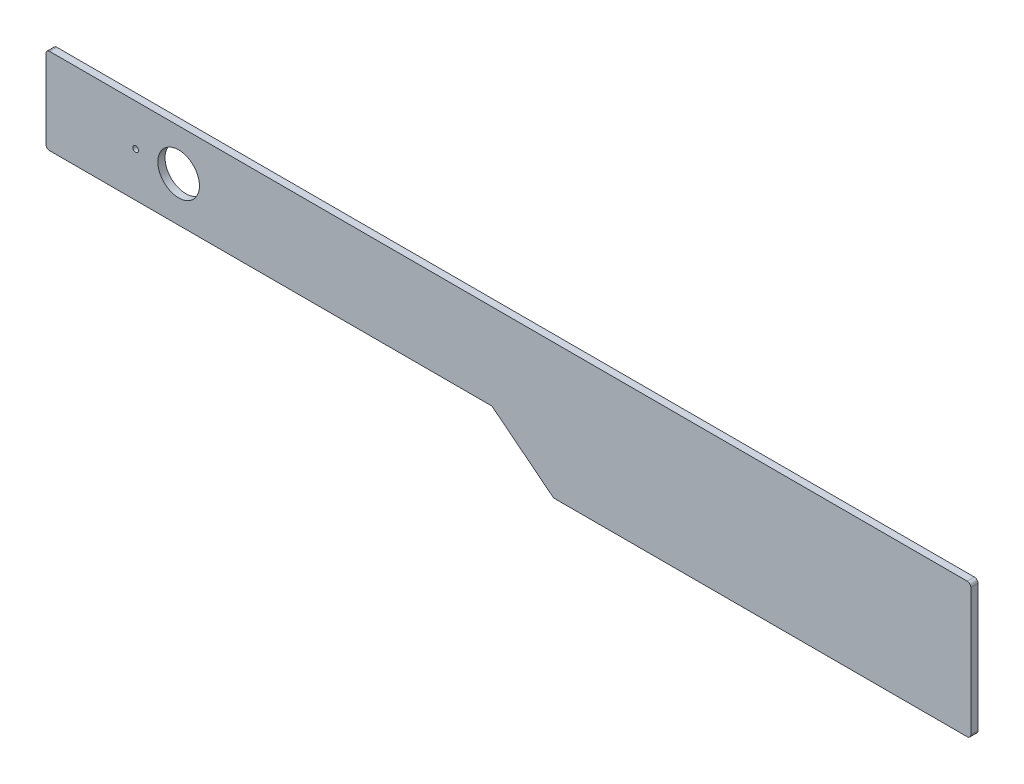
ISO-10303-21;
HEADER;
FILE_DESCRIPTION(('STEP AP214'),'2;1');
FILE_NAME('part.step','',(''),(''),'','','');
FILE_SCHEMA(('AUTOMOTIVE_DESIGN { 1 0 10303 214 1 1 1 1 }'));
ENDSEC;
DATA;
#1=APPLICATION_CONTEXT('core data for automotive mechanical design processes');
#2=APPLICATION_PROTOCOL_DEFINITION('international standard','automotive_design',2000,#1);
#3=PRODUCT_CONTEXT('',#1,'mechanical');
#4=PRODUCT('Part','Part','',(#3));
#5=PRODUCT_RELATED_PRODUCT_CATEGORY('part','',(#4));
#6=PRODUCT_DEFINITION_FORMATION('','',#4);
#7=PRODUCT_DEFINITION_CONTEXT('part definition',#1,'design');
#8=PRODUCT_DEFINITION('design','',#6,#7);
#9=PRODUCT_DEFINITION_SHAPE('','',#8);
#10=(LENGTH_UNIT() NAMED_UNIT(*) SI_UNIT(.MILLI.,.METRE.));
#11=(NAMED_UNIT(*) PLANE_ANGLE_UNIT() SI_UNIT($,.RADIAN.));
#12=(NAMED_UNIT(*) SI_UNIT($,.STERADIAN.) SOLID_ANGLE_UNIT());
#13=UNCERTAINTY_MEASURE_WITH_UNIT(LENGTH_MEASURE(1.E-05),#10,'distance_accuracy_value','');
#14=(GEOMETRIC_REPRESENTATION_CONTEXT(3) GLOBAL_UNCERTAINTY_ASSIGNED_CONTEXT((#13)) GLOBAL_UNIT_ASSIGNED_CONTEXT((#10,
#11,#12)) REPRESENTATION_CONTEXT('',''));
#15=CARTESIAN_POINT('',(0.,0.,0.));
#16=DIRECTION('',(0.,0.,1.));
#17=DIRECTION('',(1.,0.,0.));
#18=AXIS2_PLACEMENT_3D('',#15,#16,#17);
#19=CARTESIAN_POINT('',(64.,-12.3,1.));
#20=DIRECTION('',(0.,0.,-1.));
#21=DIRECTION('',(-1.,0.,0.));
#22=AXIS2_PLACEMENT_3D('',#19,#20,#21);
#23=PLANE('',#22);
#24=CARTESIAN_POINT('',(-46.,0.200000000000001,1.));
#25=DIRECTION('',(0.,0.,1.));
#26=DIRECTION('',(1.,0.,0.));
#27=AXIS2_PLACEMENT_3D('',#24,#25,#26);
#28=CIRCLE('',#27,2.9);
#29=CARTESIAN_POINT('',(-43.1,0.200000000000001,1.));
#30=VERTEX_POINT('',#29);
#31=EDGE_CURVE('E157',#30,#30,#28,.T.);
#32=ORIENTED_EDGE('',*,*,#31,.F.);
#33=EDGE_LOOP('',(#32));
#34=FACE_BOUND('',#33,.T.);
#35=DIRECTION('',(0.,1.,0.));
#36=VECTOR('',#35,1.);
#37=CARTESIAN_POINT('',(64.5,-6.,1.));
#38=LINE('',#37,#36);
#39=CARTESIAN_POINT('',(64.5,-12.3,1.));
#40=VERTEX_POINT('',#39);
#41=CARTESIAN_POINT('',(64.5,5.5,1.));
#42=VERTEX_POINT('',#41);
#43=EDGE_CURVE('E105',#40,#42,#38,.T.);
#44=ORIENTED_EDGE('',*,*,#43,.T.);
#45=CARTESIAN_POINT('',(64.,5.5,1.));
#46=DIRECTION('',(0.,0.,1.));
#47=DIRECTION('',(-1.,0.,0.));
#48=AXIS2_PLACEMENT_3D('',#45,#46,#47);
#49=CIRCLE('',#48,0.5);
#50=CARTESIAN_POINT('',(64.,6.,1.));
#51=VERTEX_POINT('',#50);
#52=EDGE_CURVE('E246',#42,#51,#49,.T.);
#53=ORIENTED_EDGE('',*,*,#52,.T.);
#54=DIRECTION('',(-1.,0.,0.));
#55=VECTOR('',#54,1.);
#56=CARTESIAN_POINT('',(-64.,6.,1.));
#57=LINE('',#56,#55);
#58=CARTESIAN_POINT('',(-64.,6.,1.));
#59=VERTEX_POINT('',#58);
#60=EDGE_CURVE('E205',#51,#59,#57,.T.);
#61=ORIENTED_EDGE('',*,*,#60,.T.);
#62=CARTESIAN_POINT('',(-64.,5.5,1.));
#63=DIRECTION('',(0.,0.,1.));
#64=DIRECTION('',(-1.,0.,0.));
#65=AXIS2_PLACEMENT_3D('',#62,#63,#64);
#66=CIRCLE('',#65,0.5);
#67=CARTESIAN_POINT('',(-64.5,5.5,1.));
#68=VERTEX_POINT('',#67);
#69=EDGE_CURVE('E224',#59,#68,#66,.T.);
#70=ORIENTED_EDGE('',*,*,#69,.T.);
#71=DIRECTION('',(0.,-1.,0.));
#72=VECTOR('',#71,1.);
#73=CARTESIAN_POINT('',(-64.5,5.5,1.));
#74=LINE('',#73,#72);
#75=CARTESIAN_POINT('',(-64.5,-5.5,1.));
#76=VERTEX_POINT('',#75);
#77=EDGE_CURVE('E221',#68,#76,#74,.T.);
#78=ORIENTED_EDGE('',*,*,#77,.T.);
#79=CARTESIAN_POINT('',(-64.,-5.5,1.));
#80=DIRECTION('',(0.,0.,1.));
#81=DIRECTION('',(-1.,0.,0.));
#82=AXIS2_PLACEMENT_3D('',#79,#80,#81);
#83=CIRCLE('',#82,0.5);
#84=CARTESIAN_POINT('',(-64.,-6.,1.));
#85=VERTEX_POINT('',#84);
#86=EDGE_CURVE('E223',#76,#85,#83,.T.);
#87=ORIENTED_EDGE('',*,*,#86,.T.);
#88=DIRECTION('',(1.,0.,0.));
#89=VECTOR('',#88,1.);
#90=CARTESIAN_POINT('',(-64.,-6.,1.));
#91=LINE('',#90,#89);
#92=CARTESIAN_POINT('',(-2.47379235727448,-6.00000000000002,1.));
#93=VERTEX_POINT('',#92);
#94=EDGE_CURVE('E226',#85,#93,#91,.T.);
#95=ORIENTED_EDGE('',*,*,#94,.T.);
#96=CARTESIAN_POINT('',(-2.47379235727448,-6.50000000000002,1.));
#97=DIRECTION('',(0.,0.,-1.));
#98=DIRECTION('',(1.,0.,0.));
#99=AXIS2_PLACEMENT_3D('',#96,#97,#98);
#100=CIRCLE('',#99,0.5);
#101=CARTESIAN_POINT('',(-2.16367456525808,-6.10779220421457,1.));
#102=VERTEX_POINT('',#101);
#103=EDGE_CURVE('E232',#93,#102,#100,.T.);
#104=ORIENTED_EDGE('',*,*,#103,.T.);
#105=DIRECTION('',(0.784415591570885,-0.620235584032792,0.));
#106=VECTOR('',#105,1.);
#107=CARTESIAN_POINT('',(6.16367456525803,-12.6922077957854,1.));
#108=LINE('',#107,#106);
#109=CARTESIAN_POINT('',(6.16367456525803,-12.6922077957854,1.));
#110=VERTEX_POINT('',#109);
#111=EDGE_CURVE('E137',#102,#110,#108,.T.);
#112=ORIENTED_EDGE('',*,*,#111,.T.);
#113=CARTESIAN_POINT('',(6.47379235727443,-12.3,1.));
#114=DIRECTION('',(0.,0.,1.));
#115=DIRECTION('',(-1.,0.,0.));
#116=AXIS2_PLACEMENT_3D('',#113,#114,#115);
#117=CIRCLE('',#116,0.5);
#118=CARTESIAN_POINT('',(6.47379235727443,-12.8,1.));
#119=VERTEX_POINT('',#118);
#120=EDGE_CURVE('E131',#110,#119,#117,.T.);
#121=ORIENTED_EDGE('',*,*,#120,.T.);
#122=DIRECTION('',(1.,0.,0.));
#123=VECTOR('',#122,1.);
#124=CARTESIAN_POINT('',(64.,-12.8,1.));
#125=LINE('',#124,#123);
#126=CARTESIAN_POINT('',(64.,-12.8,1.));
#127=VERTEX_POINT('',#126);
#128=EDGE_CURVE('E135',#119,#127,#125,.T.);
#129=ORIENTED_EDGE('',*,*,#128,.T.);
#130=CARTESIAN_POINT('',(64.,-12.3,1.));
#131=DIRECTION('',(0.,0.,1.));
#132=DIRECTION('',(-1.,0.,0.));
#133=AXIS2_PLACEMENT_3D('',#130,#131,#132);
#134=CIRCLE('',#133,0.5);
#135=EDGE_CURVE('E51',#127,#40,#134,.T.);
#136=ORIENTED_EDGE('',*,*,#135,.T.);
#137=EDGE_LOOP('',(#44,#53,#61,#70,#78,#87,#95,#104,#112,#121,#129,#136));
#138=FACE_BOUND('',#137,.T.);
#139=CARTESIAN_POINT('',(-52.,0.200000000000001,1.));
#140=DIRECTION('',(0.,0.,1.));
#141=DIRECTION('',(1.,0.,0.));
#142=AXIS2_PLACEMENT_3D('',#139,#140,#141);
#143=CIRCLE('',#142,0.399999999999998);
#144=CARTESIAN_POINT('',(-51.6,0.200000000000001,1.));
#145=VERTEX_POINT('',#144);
#146=EDGE_CURVE('E396',#145,#145,#143,.T.);
#147=ORIENTED_EDGE('',*,*,#146,.F.);
#148=EDGE_LOOP('',(#147));
#149=FACE_BOUND('',#148,.T.);
#150=ADVANCED_FACE('F34',(#34,#138,#149),#23,.F.);
#151=CARTESIAN_POINT('',(64.,-12.3,0.));
#152=DIRECTION('',(0.,0.,-1.));
#153=DIRECTION('',(-1.,0.,0.));
#154=AXIS2_PLACEMENT_3D('',#151,#152,#153);
#155=PLANE('',#154);
#156=CARTESIAN_POINT('',(-46.,0.200000000000001,0.));
#157=DIRECTION('',(0.,0.,1.));
#158=DIRECTION('',(1.,0.,0.));
#159=AXIS2_PLACEMENT_3D('',#156,#157,#158);
#160=CIRCLE('',#159,2.9);
#161=CARTESIAN_POINT('',(-43.1,0.200000000000001,0.));
#162=VERTEX_POINT('',#161);
#163=EDGE_CURVE('E250',#162,#162,#160,.T.);
#164=ORIENTED_EDGE('',*,*,#163,.T.);
#165=EDGE_LOOP('',(#164));
#166=FACE_BOUND('',#165,.T.);
#167=DIRECTION('',(0.,1.,0.));
#168=VECTOR('',#167,1.);
#169=CARTESIAN_POINT('',(64.5,5.5,0.));
#170=LINE('',#169,#168);
#171=CARTESIAN_POINT('',(64.5,-12.3,0.));
#172=VERTEX_POINT('',#171);
#173=CARTESIAN_POINT('',(64.5,5.5,0.));
#174=VERTEX_POINT('',#173);
#175=EDGE_CURVE('E99',#172,#174,#170,.T.);
#176=ORIENTED_EDGE('',*,*,#175,.F.);
#177=CARTESIAN_POINT('',(64.,-12.3,0.));
#178=DIRECTION('',(0.,0.,1.));
#179=DIRECTION('',(-1.,0.,0.));
#180=AXIS2_PLACEMENT_3D('',#177,#178,#179);
#181=CIRCLE('',#180,0.5);
#182=CARTESIAN_POINT('',(64.,-12.8,0.));
#183=VERTEX_POINT('',#182);
#184=EDGE_CURVE('E175',#183,#172,#181,.T.);
#185=ORIENTED_EDGE('',*,*,#184,.F.);
#186=DIRECTION('',(1.,0.,0.));
#187=VECTOR('',#186,1.);
#188=CARTESIAN_POINT('',(64.,-12.8,0.));
#189=LINE('',#188,#187);
#190=CARTESIAN_POINT('',(6.47379235727443,-12.8,0.));
#191=VERTEX_POINT('',#190);
#192=EDGE_CURVE('E92',#191,#183,#189,.T.);
#193=ORIENTED_EDGE('',*,*,#192,.F.);
#194=CARTESIAN_POINT('',(6.47379235727443,-12.3,0.));
#195=DIRECTION('',(0.,0.,1.));
#196=DIRECTION('',(-1.,0.,0.));
#197=AXIS2_PLACEMENT_3D('',#194,#195,#196);
#198=CIRCLE('',#197,0.5);
#199=CARTESIAN_POINT('',(6.16367456525803,-12.6922077957854,0.));
#200=VERTEX_POINT('',#199);
#201=EDGE_CURVE('E145',#200,#191,#198,.T.);
#202=ORIENTED_EDGE('',*,*,#201,.F.);
#203=DIRECTION('',(0.784415591570885,-0.620235584032792,0.));
#204=VECTOR('',#203,1.);
#205=CARTESIAN_POINT('',(6.16367456525803,-12.6922077957854,0.));
#206=LINE('',#205,#204);
#207=CARTESIAN_POINT('',(-2.16367456525808,-6.10779220421457,0.));
#208=VERTEX_POINT('',#207);
#209=EDGE_CURVE('E171',#208,#200,#206,.T.);
#210=ORIENTED_EDGE('',*,*,#209,.F.);
#211=CARTESIAN_POINT('',(-2.47379235727448,-6.50000000000002,0.));
#212=DIRECTION('',(0.,0.,-1.));
#213=DIRECTION('',(1.,0.,0.));
#214=AXIS2_PLACEMENT_3D('',#211,#212,#213);
#215=CIRCLE('',#214,0.5);
#216=CARTESIAN_POINT('',(-2.47379235727448,-6.00000000000002,0.));
#217=VERTEX_POINT('',#216);
#218=EDGE_CURVE('E169',#217,#208,#215,.T.);
#219=ORIENTED_EDGE('',*,*,#218,.F.);
#220=DIRECTION('',(1.,0.,0.));
#221=VECTOR('',#220,1.);
#222=CARTESIAN_POINT('',(-64.,-6.,0.));
#223=LINE('',#222,#221);
#224=CARTESIAN_POINT('',(-64.,-6.,0.));
#225=VERTEX_POINT('',#224);
#226=EDGE_CURVE('E167',#225,#217,#223,.T.);
#227=ORIENTED_EDGE('',*,*,#226,.F.);
#228=CARTESIAN_POINT('',(-64.,-5.5,0.));
#229=DIRECTION('',(0.,0.,1.));
#230=DIRECTION('',(-1.,0.,0.));
#231=AXIS2_PLACEMENT_3D('',#228,#229,#230);
#232=CIRCLE('',#231,0.5);
#233=CARTESIAN_POINT('',(-64.5,-5.5,0.));
#234=VERTEX_POINT('',#233);
#235=EDGE_CURVE('E165',#234,#225,#232,.T.);
#236=ORIENTED_EDGE('',*,*,#235,.F.);
#237=DIRECTION('',(0.,-1.,0.));
#238=VECTOR('',#237,1.);
#239=CARTESIAN_POINT('',(-64.5,5.5,0.));
#240=LINE('',#239,#238);
#241=CARTESIAN_POINT('',(-64.5,5.5,0.));
#242=VERTEX_POINT('',#241);
#243=EDGE_CURVE('E163',#242,#234,#240,.T.);
#244=ORIENTED_EDGE('',*,*,#243,.F.);
#245=CARTESIAN_POINT('',(-64.,5.5,0.));
#246=DIRECTION('',(0.,0.,1.));
#247=DIRECTION('',(-1.,0.,0.));
#248=AXIS2_PLACEMENT_3D('',#245,#246,#247);
#249=CIRCLE('',#248,0.5);
#250=CARTESIAN_POINT('',(-64.,6.,0.));
#251=VERTEX_POINT('',#250);
#252=EDGE_CURVE('E161',#251,#242,#249,.T.);
#253=ORIENTED_EDGE('',*,*,#252,.F.);
#254=DIRECTION('',(-1.,0.,0.));
#255=VECTOR('',#254,1.);
#256=CARTESIAN_POINT('',(-64.,6.,0.));
#257=LINE('',#256,#255);
#258=CARTESIAN_POINT('',(64.,6.,0.));
#259=VERTEX_POINT('',#258);
#260=EDGE_CURVE('E159',#259,#251,#257,.T.);
#261=ORIENTED_EDGE('',*,*,#260,.F.);
#262=CARTESIAN_POINT('',(64.,5.5,0.));
#263=DIRECTION('',(0.,0.,1.));
#264=DIRECTION('',(-1.,0.,0.));
#265=AXIS2_PLACEMENT_3D('',#262,#263,#264);
#266=CIRCLE('',#265,0.5);
#267=EDGE_CURVE('E156',#174,#259,#266,.T.);
#268=ORIENTED_EDGE('',*,*,#267,.F.);
#269=EDGE_LOOP('',(#176,#185,#193,#202,#210,#219,#227,#236,#244,#253,#261,#268));
#270=FACE_BOUND('',#269,.T.);
#271=CARTESIAN_POINT('',(-52.,0.200000000000001,0.));
#272=DIRECTION('',(0.,0.,1.));
#273=DIRECTION('',(1.,0.,0.));
#274=AXIS2_PLACEMENT_3D('',#271,#272,#273);
#275=CIRCLE('',#274,0.399999999999998);
#276=CARTESIAN_POINT('',(-51.6,0.200000000000001,0.));
#277=VERTEX_POINT('',#276);
#278=EDGE_CURVE('E399',#277,#277,#275,.T.);
#279=ORIENTED_EDGE('',*,*,#278,.T.);
#280=EDGE_LOOP('',(#279));
#281=FACE_BOUND('',#280,.T.);
#282=ADVANCED_FACE('F209',(#166,#270,#281),#155,.T.);
#283=CARTESIAN_POINT('',(64.5,5.5,1.));
#284=DIRECTION('',(-1.,0.,0.));
#285=DIRECTION('',(0.,0.,1.));
#286=AXIS2_PLACEMENT_3D('',#283,#284,#285);
#287=PLANE('',#286);
#288=ORIENTED_EDGE('',*,*,#175,.T.);
#289=DIRECTION('',(0.,0.,-1.));
#290=VECTOR('',#289,1.);
#291=CARTESIAN_POINT('',(64.5,5.5,1.));
#292=LINE('',#291,#290);
#293=EDGE_CURVE('E11',#42,#174,#292,.T.);
#294=ORIENTED_EDGE('',*,*,#293,.F.);
#295=ORIENTED_EDGE('',*,*,#43,.F.);
#296=DIRECTION('',(0.,0.,-1.));
#297=VECTOR('',#296,1.);
#298=CARTESIAN_POINT('',(64.5,-12.3,1.));
#299=LINE('',#298,#297);
#300=EDGE_CURVE('E151',#40,#172,#299,.T.);
#301=ORIENTED_EDGE('',*,*,#300,.T.);
#302=EDGE_LOOP('',(#288,#294,#295,#301));
#303=FACE_BOUND('',#302,.T.);
#304=ADVANCED_FACE('F36',(#303),#287,.F.);
#305=CARTESIAN_POINT('',(64.,5.5,1.));
#306=DIRECTION('',(0.,0.,-1.));
#307=DIRECTION('',(-1.,0.,0.));
#308=AXIS2_PLACEMENT_3D('',#305,#306,#307);
#309=CYLINDRICAL_SURFACE('',#308,0.5);
#310=ORIENTED_EDGE('',*,*,#267,.T.);
#311=DIRECTION('',(0.,0.,-1.));
#312=VECTOR('',#311,1.);
#313=CARTESIAN_POINT('',(64.,6.,1.));
#314=LINE('',#313,#312);
#315=EDGE_CURVE('E43',#51,#259,#314,.T.);
#316=ORIENTED_EDGE('',*,*,#315,.F.);
#317=ORIENTED_EDGE('',*,*,#52,.F.);
#318=ORIENTED_EDGE('',*,*,#293,.T.);
#319=EDGE_LOOP('',(#310,#316,#317,#318));
#320=FACE_BOUND('',#319,.T.);
#321=ADVANCED_FACE('F252',(#320),#309,.T.);
#322=CARTESIAN_POINT('',(-64.,6.,1.));
#323=DIRECTION('',(0.,-1.,0.));
#324=DIRECTION('',(0.,0.,-1.));
#325=AXIS2_PLACEMENT_3D('',#322,#323,#324);
#326=PLANE('',#325);
#327=ORIENTED_EDGE('',*,*,#260,.T.);
#328=DIRECTION('',(0.,0.,-1.));
#329=VECTOR('',#328,1.);
#330=CARTESIAN_POINT('',(-64.,6.,1.));
#331=LINE('',#330,#329);
#332=EDGE_CURVE('E196',#59,#251,#331,.T.);
#333=ORIENTED_EDGE('',*,*,#332,.F.);
#334=ORIENTED_EDGE('',*,*,#60,.F.);
#335=ORIENTED_EDGE('',*,*,#315,.T.);
#336=EDGE_LOOP('',(#327,#333,#334,#335));
#337=FACE_BOUND('',#336,.T.);
#338=ADVANCED_FACE('F203',(#337),#326,.F.);
#339=CARTESIAN_POINT('',(-64.,5.5,1.));
#340=DIRECTION('',(0.,0.,-1.));
#341=DIRECTION('',(-1.,0.,0.));
#342=AXIS2_PLACEMENT_3D('',#339,#340,#341);
#343=CYLINDRICAL_SURFACE('',#342,0.5);
#344=ORIENTED_EDGE('',*,*,#252,.T.);
#345=DIRECTION('',(0.,0.,-1.));
#346=VECTOR('',#345,1.);
#347=CARTESIAN_POINT('',(-64.5,5.5,1.));
#348=LINE('',#347,#346);
#349=EDGE_CURVE('E193',#68,#242,#348,.T.);
#350=ORIENTED_EDGE('',*,*,#349,.F.);
#351=ORIENTED_EDGE('',*,*,#69,.F.);
#352=ORIENTED_EDGE('',*,*,#332,.T.);
#353=EDGE_LOOP('',(#344,#350,#351,#352));
#354=FACE_BOUND('',#353,.T.);
#355=ADVANCED_FACE('F215',(#354),#343,.T.);
#356=CARTESIAN_POINT('',(-64.5,5.5,1.));
#357=DIRECTION('',(1.,0.,0.));
#358=DIRECTION('',(0.,0.,-1.));
#359=AXIS2_PLACEMENT_3D('',#356,#357,#358);
#360=PLANE('',#359);
#361=ORIENTED_EDGE('',*,*,#243,.T.);
#362=DIRECTION('',(0.,0.,-1.));
#363=VECTOR('',#362,1.);
#364=CARTESIAN_POINT('',(-64.5,-5.5,1.));
#365=LINE('',#364,#363);
#366=EDGE_CURVE('E190',#76,#234,#365,.T.);
#367=ORIENTED_EDGE('',*,*,#366,.F.);
#368=ORIENTED_EDGE('',*,*,#77,.F.);
#369=ORIENTED_EDGE('',*,*,#349,.T.);
#370=EDGE_LOOP('',(#361,#367,#368,#369));
#371=FACE_BOUND('',#370,.T.);
#372=ADVANCED_FACE('F219',(#371),#360,.F.);
#373=CARTESIAN_POINT('',(-64.,-5.5,1.));
#374=DIRECTION('',(0.,0.,-1.));
#375=DIRECTION('',(-1.,0.,0.));
#376=AXIS2_PLACEMENT_3D('',#373,#374,#375);
#377=CYLINDRICAL_SURFACE('',#376,0.5);
#378=ORIENTED_EDGE('',*,*,#235,.T.);
#379=DIRECTION('',(0.,0.,-1.));
#380=VECTOR('',#379,1.);
#381=CARTESIAN_POINT('',(-64.,-6.,1.));
#382=LINE('',#381,#380);
#383=EDGE_CURVE('E187',#85,#225,#382,.T.);
#384=ORIENTED_EDGE('',*,*,#383,.F.);
#385=ORIENTED_EDGE('',*,*,#86,.F.);
#386=ORIENTED_EDGE('',*,*,#366,.T.);
#387=EDGE_LOOP('',(#378,#384,#385,#386));
#388=FACE_BOUND('',#387,.T.);
#389=ADVANCED_FACE('F285',(#388),#377,.T.);
#390=CARTESIAN_POINT('',(-64.,-6.,1.));
#391=DIRECTION('',(0.,1.,0.));
#392=DIRECTION('',(-1.,0.,0.));
#393=AXIS2_PLACEMENT_3D('',#390,#391,#392);
#394=PLANE('',#393);
#395=ORIENTED_EDGE('',*,*,#226,.T.);
#396=DIRECTION('',(0.,0.,-1.));
#397=VECTOR('',#396,1.);
#398=CARTESIAN_POINT('',(-2.47379235727448,-6.00000000000002,1.));
#399=LINE('',#398,#397);
#400=EDGE_CURVE('E184',#93,#217,#399,.T.);
#401=ORIENTED_EDGE('',*,*,#400,.F.);
#402=ORIENTED_EDGE('',*,*,#94,.F.);
#403=ORIENTED_EDGE('',*,*,#383,.T.);
#404=EDGE_LOOP('',(#395,#401,#402,#403));
#405=FACE_BOUND('',#404,.T.);
#406=ADVANCED_FACE('F282',(#405),#394,.F.);
#407=CARTESIAN_POINT('',(-2.47379235727448,-6.50000000000002,1.));
#408=DIRECTION('',(0.,0.,-1.));
#409=DIRECTION('',(-1.,0.,0.));
#410=AXIS2_PLACEMENT_3D('',#407,#408,#409);
#411=CYLINDRICAL_SURFACE('',#410,0.5);
#412=ORIENTED_EDGE('',*,*,#218,.T.);
#413=DIRECTION('',(0.,0.,-1.));
#414=VECTOR('',#413,1.);
#415=CARTESIAN_POINT('',(-2.16367456525808,-6.10779220421457,1.));
#416=LINE('',#415,#414);
#417=EDGE_CURVE('E181',#102,#208,#416,.T.);
#418=ORIENTED_EDGE('',*,*,#417,.F.);
#419=ORIENTED_EDGE('',*,*,#103,.F.);
#420=ORIENTED_EDGE('',*,*,#400,.T.);
#421=EDGE_LOOP('',(#412,#418,#419,#420));
#422=FACE_BOUND('',#421,.T.);
#423=ADVANCED_FACE('F238',(#422),#411,.F.);
#424=CARTESIAN_POINT('',(6.16367456525803,-12.6922077957854,1.));
#425=DIRECTION('',(0.620235584032792,0.784415591570885,0.));
#426=DIRECTION('',(-0.784415591570885,0.620235584032792,0.));
#427=AXIS2_PLACEMENT_3D('',#424,#425,#426);
#428=PLANE('',#427);
#429=ORIENTED_EDGE('',*,*,#209,.T.);
#430=DIRECTION('',(0.,0.,-1.));
#431=VECTOR('',#430,1.);
#432=CARTESIAN_POINT('',(6.16367456525803,-12.6922077957854,1.));
#433=LINE('',#432,#431);
#434=EDGE_CURVE('E146',#110,#200,#433,.T.);
#435=ORIENTED_EDGE('',*,*,#434,.F.);
#436=ORIENTED_EDGE('',*,*,#111,.F.);
#437=ORIENTED_EDGE('',*,*,#417,.T.);
#438=EDGE_LOOP('',(#429,#435,#436,#437));
#439=FACE_BOUND('',#438,.T.);
#440=ADVANCED_FACE('F242',(#439),#428,.F.);
#441=CARTESIAN_POINT('',(6.47379235727443,-12.3,1.));
#442=DIRECTION('',(0.,0.,-1.));
#443=DIRECTION('',(-1.,0.,0.));
#444=AXIS2_PLACEMENT_3D('',#441,#442,#443);
#445=CYLINDRICAL_SURFACE('',#444,0.5);
#446=ORIENTED_EDGE('',*,*,#201,.T.);
#447=DIRECTION('',(0.,0.,-1.));
#448=VECTOR('',#447,1.);
#449=CARTESIAN_POINT('',(6.47379235727443,-12.8,1.));
#450=LINE('',#449,#448);
#451=EDGE_CURVE('E142',#119,#191,#450,.T.);
#452=ORIENTED_EDGE('',*,*,#451,.F.);
#453=ORIENTED_EDGE('',*,*,#120,.F.);
#454=ORIENTED_EDGE('',*,*,#434,.T.);
#455=EDGE_LOOP('',(#446,#452,#453,#454));
#456=FACE_BOUND('',#455,.T.);
#457=ADVANCED_FACE('F143',(#456),#445,.T.);
#458=CARTESIAN_POINT('',(64.,-12.8,1.));
#459=DIRECTION('',(0.,1.,0.));
#460=DIRECTION('',(-1.,0.,0.));
#461=AXIS2_PLACEMENT_3D('',#458,#459,#460);
#462=PLANE('',#461);
#463=ORIENTED_EDGE('',*,*,#192,.T.);
#464=DIRECTION('',(0.,0.,-1.));
#465=VECTOR('',#464,1.);
#466=CARTESIAN_POINT('',(64.,-12.8,1.));
#467=LINE('',#466,#465);
#468=EDGE_CURVE('E147',#127,#183,#467,.T.);
#469=ORIENTED_EDGE('',*,*,#468,.F.);
#470=ORIENTED_EDGE('',*,*,#128,.F.);
#471=ORIENTED_EDGE('',*,*,#451,.T.);
#472=EDGE_LOOP('',(#463,#469,#470,#471));
#473=FACE_BOUND('',#472,.T.);
#474=ADVANCED_FACE('F149',(#473),#462,.F.);
#475=CARTESIAN_POINT('',(64.,-12.3,1.));
#476=DIRECTION('',(0.,0.,-1.));
#477=DIRECTION('',(-1.,0.,0.));
#478=AXIS2_PLACEMENT_3D('',#475,#476,#477);
#479=CYLINDRICAL_SURFACE('',#478,0.5);
#480=ORIENTED_EDGE('',*,*,#184,.T.);
#481=ORIENTED_EDGE('',*,*,#300,.F.);
#482=ORIENTED_EDGE('',*,*,#135,.F.);
#483=ORIENTED_EDGE('',*,*,#468,.T.);
#484=EDGE_LOOP('',(#480,#481,#482,#483));
#485=FACE_BOUND('',#484,.T.);
#486=ADVANCED_FACE('F244',(#485),#479,.T.);
#487=CARTESIAN_POINT('',(-46.,0.200000000000001,1.));
#488=DIRECTION('',(0.,0.,-1.));
#489=DIRECTION('',(-1.,0.,0.));
#490=AXIS2_PLACEMENT_3D('',#487,#488,#489);
#491=CYLINDRICAL_SURFACE('',#490,2.9);
#492=ORIENTED_EDGE('',*,*,#31,.T.);
#493=EDGE_LOOP('',(#492));
#494=FACE_BOUND('',#493,.T.);
#495=ORIENTED_EDGE('',*,*,#163,.F.);
#496=EDGE_LOOP('',(#495));
#497=FACE_BOUND('',#496,.T.);
#498=ADVANCED_FACE('F269',(#494,#497),#491,.F.);
#499=CARTESIAN_POINT('',(-52.,0.200000000000001,1.));
#500=DIRECTION('',(0.,0.,-1.));
#501=DIRECTION('',(-1.,0.,0.));
#502=AXIS2_PLACEMENT_3D('',#499,#500,#501);
#503=CYLINDRICAL_SURFACE('',#502,0.399999999999998);
#504=ORIENTED_EDGE('',*,*,#146,.T.);
#505=EDGE_LOOP('',(#504));
#506=FACE_BOUND('',#505,.T.);
#507=ORIENTED_EDGE('',*,*,#278,.F.);
#508=EDGE_LOOP('',(#507));
#509=FACE_BOUND('',#508,.T.);
#510=ADVANCED_FACE('F335',(#506,#509),#503,.F.);
#511=CLOSED_SHELL('',(#150,#282,#304,#321,#338,#355,#372,#389,#406,#423,#440,#457,#474,#486,
#498,#510));
#512=MANIFOLD_SOLID_BREP('B2',#511);
#513=ADVANCED_BREP_SHAPE_REPRESENTATION('',(#18,#512),#14);
#514=SHAPE_DEFINITION_REPRESENTATION(#9,#513);
ENDSEC;
END-ISO-10303-21;
